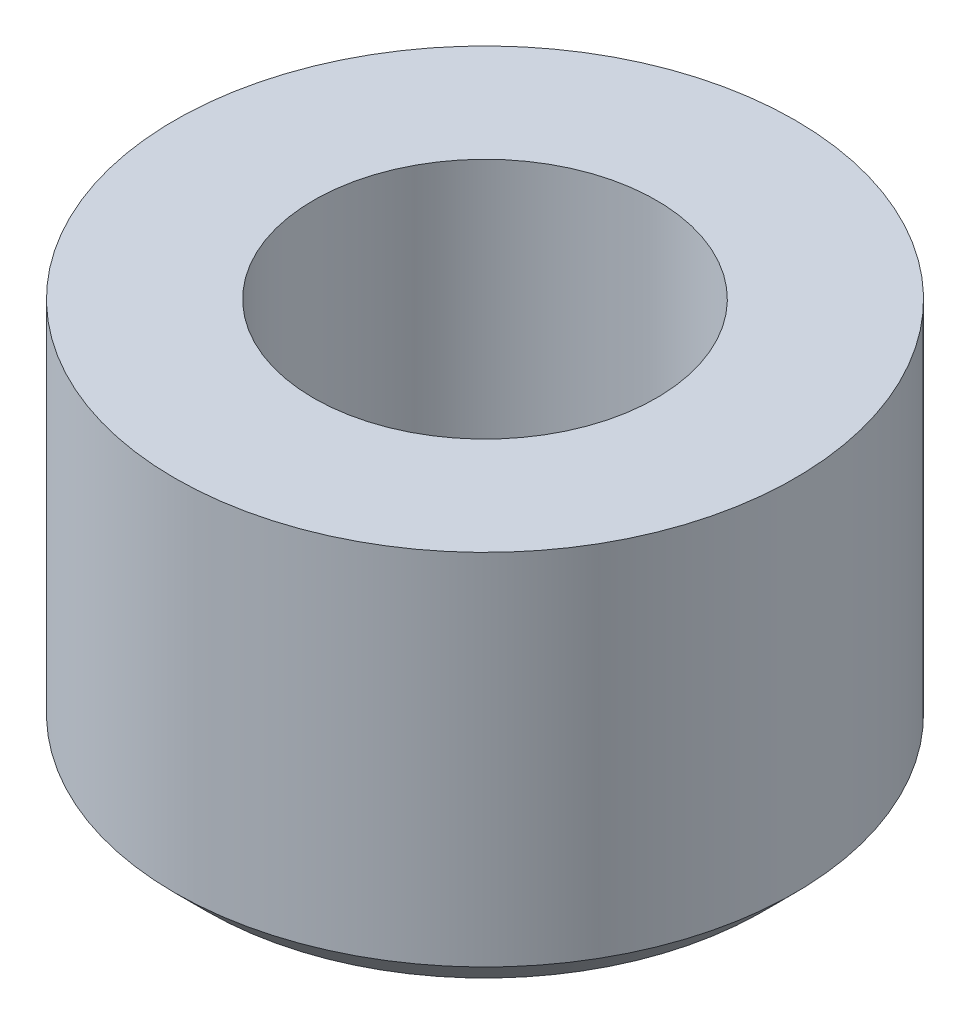
ISO-10303-21;
HEADER;
FILE_DESCRIPTION(('STEP AP214'),'2;1');
FILE_NAME('part.step','',(''),(''),'','','');
FILE_SCHEMA(('AUTOMOTIVE_DESIGN { 1 0 10303 214 1 1 1 1 }'));
ENDSEC;
DATA;
#1=APPLICATION_CONTEXT('core data for automotive mechanical design processes');
#2=APPLICATION_PROTOCOL_DEFINITION('international standard','automotive_design',2000,#1);
#3=PRODUCT_CONTEXT('',#1,'mechanical');
#4=PRODUCT('Part','Part','',(#3));
#5=PRODUCT_RELATED_PRODUCT_CATEGORY('part','',(#4));
#6=PRODUCT_DEFINITION_FORMATION('','',#4);
#7=PRODUCT_DEFINITION_CONTEXT('part definition',#1,'design');
#8=PRODUCT_DEFINITION('design','',#6,#7);
#9=PRODUCT_DEFINITION_SHAPE('','',#8);
#10=(LENGTH_UNIT() NAMED_UNIT(*) SI_UNIT(.MILLI.,.METRE.));
#11=(NAMED_UNIT(*) PLANE_ANGLE_UNIT() SI_UNIT($,.RADIAN.));
#12=(NAMED_UNIT(*) SI_UNIT($,.STERADIAN.) SOLID_ANGLE_UNIT());
#13=UNCERTAINTY_MEASURE_WITH_UNIT(LENGTH_MEASURE(1.E-05),#10,'distance_accuracy_value','');
#14=(GEOMETRIC_REPRESENTATION_CONTEXT(3) GLOBAL_UNCERTAINTY_ASSIGNED_CONTEXT((#13)) GLOBAL_UNIT_ASSIGNED_CONTEXT((#10,
#11,#12)) REPRESENTATION_CONTEXT('',''));
#15=CARTESIAN_POINT('',(0.,0.,0.));
#16=DIRECTION('',(0.,0.,1.));
#17=DIRECTION('',(1.,0.,0.));
#18=AXIS2_PLACEMENT_3D('',#15,#16,#17);
#19=CARTESIAN_POINT('',(0.,4.8,0.));
#20=DIRECTION('',(0.,1.,0.));
#21=DIRECTION('',(0.,0.,1.));
#22=AXIS2_PLACEMENT_3D('',#19,#20,#21);
#23=PLANE('',#22);
#24=CARTESIAN_POINT('',(0.,4.8,0.));
#25=DIRECTION('',(0.,1.,0.));
#26=DIRECTION('',(0.,0.,1.));
#27=AXIS2_PLACEMENT_3D('',#24,#25,#26);
#28=CIRCLE('',#27,3.8);
#29=CARTESIAN_POINT('',(0.,4.8,3.8));
#30=VERTEX_POINT('',#29);
#31=EDGE_CURVE('E49',#30,#30,#28,.T.);
#32=ORIENTED_EDGE('',*,*,#31,.T.);
#33=EDGE_LOOP('',(#32));
#34=FACE_BOUND('',#33,.T.);
#35=CARTESIAN_POINT('',(0.,4.8,0.));
#36=DIRECTION('',(0.,1.,0.));
#37=DIRECTION('',(0.,0.,1.));
#38=AXIS2_PLACEMENT_3D('',#35,#36,#37);
#39=CIRCLE('',#38,2.1);
#40=CARTESIAN_POINT('',(0.,4.8,2.1));
#41=VERTEX_POINT('',#40);
#42=EDGE_CURVE('E53',#41,#41,#39,.T.);
#43=ORIENTED_EDGE('',*,*,#42,.F.);
#44=EDGE_LOOP('',(#43));
#45=FACE_BOUND('',#44,.T.);
#46=ADVANCED_FACE('F37',(#34,#45),#23,.T.);
#47=CARTESIAN_POINT('',(0.,0.,0.));
#48=DIRECTION('',(0.,1.,0.));
#49=DIRECTION('',(0.,0.,1.));
#50=AXIS2_PLACEMENT_3D('',#47,#48,#49);
#51=PLANE('',#50);
#52=CARTESIAN_POINT('',(0.,0.,0.));
#53=DIRECTION('',(0.,1.,0.));
#54=DIRECTION('',(0.,0.,1.));
#55=AXIS2_PLACEMENT_3D('',#52,#53,#54);
#56=CIRCLE('',#55,3.4);
#57=CARTESIAN_POINT('',(0.,0.,3.4));
#58=VERTEX_POINT('',#57);
#59=EDGE_CURVE('E10',#58,#58,#56,.F.);
#60=ORIENTED_EDGE('',*,*,#59,.T.);
#61=EDGE_LOOP('',(#60));
#62=FACE_BOUND('',#61,.T.);
#63=CARTESIAN_POINT('',(0.,0.,0.));
#64=DIRECTION('',(0.,1.,0.));
#65=DIRECTION('',(0.,0.,1.));
#66=AXIS2_PLACEMENT_3D('',#63,#64,#65);
#67=CIRCLE('',#66,2.1);
#68=CARTESIAN_POINT('',(0.,0.,2.1));
#69=VERTEX_POINT('',#68);
#70=EDGE_CURVE('E56',#69,#69,#67,.T.);
#71=ORIENTED_EDGE('',*,*,#70,.T.);
#72=EDGE_LOOP('',(#71));
#73=FACE_BOUND('',#72,.T.);
#74=ADVANCED_FACE('F66',(#62,#73),#51,.F.);
#75=CARTESIAN_POINT('',(0.,4.8,0.));
#76=DIRECTION('',(0.,-1.,0.));
#77=DIRECTION('',(0.,0.,-1.));
#78=AXIS2_PLACEMENT_3D('',#75,#76,#77);
#79=CYLINDRICAL_SURFACE('',#78,3.8);
#80=CARTESIAN_POINT('',(0.,0.399999869282062,0.));
#81=DIRECTION('',(0.,1.,0.));
#82=DIRECTION('',(0.,0.,1.));
#83=AXIS2_PLACEMENT_3D('',#80,#81,#82);
#84=CIRCLE('',#83,3.8);
#85=CARTESIAN_POINT('',(0.,0.399999869282062,3.8));
#86=VERTEX_POINT('',#85);
#87=EDGE_CURVE('E45',#86,#86,#84,.T.);
#88=ORIENTED_EDGE('',*,*,#87,.T.);
#89=EDGE_LOOP('',(#88));
#90=FACE_BOUND('',#89,.T.);
#91=ORIENTED_EDGE('',*,*,#31,.F.);
#92=EDGE_LOOP('',(#91));
#93=FACE_BOUND('',#92,.T.);
#94=ADVANCED_FACE('F72',(#90,#93),#79,.T.);
#95=CARTESIAN_POINT('',(0.,4.8,0.));
#96=DIRECTION('',(0.,-1.,0.));
#97=DIRECTION('',(0.,0.,-1.));
#98=AXIS2_PLACEMENT_3D('',#95,#96,#97);
#99=CYLINDRICAL_SURFACE('',#98,2.1);
#100=ORIENTED_EDGE('',*,*,#42,.T.);
#101=EDGE_LOOP('',(#100));
#102=FACE_BOUND('',#101,.T.);
#103=ORIENTED_EDGE('',*,*,#70,.F.);
#104=EDGE_LOOP('',(#103));
#105=FACE_BOUND('',#104,.T.);
#106=ADVANCED_FACE('F62',(#102,#105),#99,.F.);
#107=CARTESIAN_POINT('',(0.,0.399999869282062,0.));
#108=DIRECTION('',(0.,1.,0.));
#109=DIRECTION('',(0.,0.,1.));
#110=AXIS2_PLACEMENT_3D('',#107,#108,#109);
#111=CONICAL_SURFACE('',#110,3.8,0.785398326794902);
#112=CARTESIAN_POINT('',(0.,0.,3.4));
#113=CARTESIAN_POINT('',(0.,0.00416666530502154,3.40416666666666));
#114=CARTESIAN_POINT('',(0.,0.008333330610043,3.40833333333333));
#115=CARTESIAN_POINT('',(0.,0.0166666612200859,3.41666666666666));
#116=CARTESIAN_POINT('',(0.,0.0208333265251073,3.42083333333333));
#117=CARTESIAN_POINT('',(0.,0.0291666571351503,3.42916666666666));
#118=CARTESIAN_POINT('',(0.,0.0333333224401718,3.43333333333333));
#119=CARTESIAN_POINT('',(0.,0.0416666530502148,3.44166666666666));
#120=CARTESIAN_POINT('',(0.,0.0458333183552363,3.44583333333333));
#121=CARTESIAN_POINT('',(0.,0.0541666489652792,3.45416666666666));
#122=CARTESIAN_POINT('',(0.,0.0583333142703006,3.45833333333333));
#123=CARTESIAN_POINT('',(0.,0.0666666448803436,3.46666666666666));
#124=CARTESIAN_POINT('',(0.,0.0708333101853651,3.47083333333333));
#125=CARTESIAN_POINT('',(0.,0.0791666407954081,3.47916666666666));
#126=CARTESIAN_POINT('',(0.,0.0833333061004295,3.48333333333333));
#127=CARTESIAN_POINT('',(0.,0.0916666367104725,3.49166666666666));
#128=CARTESIAN_POINT('',(0.,0.095833302015494,3.49583333333333));
#129=CARTESIAN_POINT('',(0.,0.104166632625537,3.50416666666666));
#130=CARTESIAN_POINT('',(0.,0.108333297930558,3.50833333333333));
#131=CARTESIAN_POINT('',(0.,0.116666628540601,3.51666666666666));
#132=CARTESIAN_POINT('',(0.,0.120833293845623,3.52083333333333));
#133=CARTESIAN_POINT('',(0.,0.129166624455666,3.52916666666666));
#134=CARTESIAN_POINT('',(0.,0.133333289760687,3.53333333333333));
#135=CARTESIAN_POINT('',(0.,0.14166662037073,3.54166666666666));
#136=CARTESIAN_POINT('',(0.,0.145833285675752,3.54583333333333));
#137=CARTESIAN_POINT('',(0.,0.154166616285795,3.55416666666666));
#138=CARTESIAN_POINT('',(0.,0.158333281590816,3.55833333333333));
#139=CARTESIAN_POINT('',(0.,0.166666612200859,3.56666666666666));
#140=CARTESIAN_POINT('',(0.,0.170833277505881,3.57083333333333));
#141=CARTESIAN_POINT('',(0.,0.179166608115923,3.57916666666666));
#142=CARTESIAN_POINT('',(0.,0.183333273420945,3.58333333333333));
#143=CARTESIAN_POINT('',(0.,0.191666604030988,3.59166666666666));
#144=CARTESIAN_POINT('',(0.,0.195833269336009,3.59583333333333));
#145=CARTESIAN_POINT('',(0.,0.204166599946052,3.60416666666666));
#146=CARTESIAN_POINT('',(0.,0.208333265251074,3.60833333333333));
#147=CARTESIAN_POINT('',(0.,0.216666595861117,3.61666666666666));
#148=CARTESIAN_POINT('',(0.,0.220833261166138,3.62083333333333));
#149=CARTESIAN_POINT('',(0.,0.229166591776181,3.62916666666667));
#150=CARTESIAN_POINT('',(0.,0.233333257081203,3.63333333333333));
#151=CARTESIAN_POINT('',(0.,0.241666587691246,3.64166666666666));
#152=CARTESIAN_POINT('',(0.,0.245833252996267,3.64583333333333));
#153=CARTESIAN_POINT('',(0.,0.25416658360631,3.65416666666667));
#154=CARTESIAN_POINT('',(0.,0.258333248911332,3.65833333333333));
#155=CARTESIAN_POINT('',(0.,0.266666579521375,3.66666666666667));
#156=CARTESIAN_POINT('',(0.,0.270833244826396,3.67083333333333));
#157=CARTESIAN_POINT('',(0.,0.279166575436439,3.67916666666667));
#158=CARTESIAN_POINT('',(0.,0.28333324074146,3.68333333333333));
#159=CARTESIAN_POINT('',(0.,0.291666571351503,3.69166666666667));
#160=CARTESIAN_POINT('',(0.,0.295833236656525,3.69583333333333));
#161=CARTESIAN_POINT('',(0.,0.304166567266568,3.70416666666667));
#162=CARTESIAN_POINT('',(0.,0.308333232571589,3.70833333333333));
#163=CARTESIAN_POINT('',(0.,0.316666563181632,3.71666666666667));
#164=CARTESIAN_POINT('',(0.,0.320833228486654,3.72083333333333));
#165=CARTESIAN_POINT('',(0.,0.329166559096697,3.72916666666667));
#166=CARTESIAN_POINT('',(0.,0.333333224401718,3.73333333333333));
#167=CARTESIAN_POINT('',(0.,0.341666555011761,3.74166666666667));
#168=CARTESIAN_POINT('',(0.,0.345833220316783,3.74583333333333));
#169=CARTESIAN_POINT('',(0.,0.354166550926826,3.75416666666667));
#170=CARTESIAN_POINT('',(0.,0.358333216231847,3.75833333333333));
#171=CARTESIAN_POINT('',(0.,0.36666654684189,3.76666666666667));
#172=CARTESIAN_POINT('',(0.,0.370833212146912,3.77083333333333));
#173=CARTESIAN_POINT('',(0.,0.379166542756954,3.77916666666667));
#174=CARTESIAN_POINT('',(0.,0.383333208061976,3.78333333333333));
#175=CARTESIAN_POINT('',(0.,0.391666538672019,3.79166666666667));
#176=CARTESIAN_POINT('',(0.,0.395833203977041,3.79583333333333));
#177=CARTESIAN_POINT('',(0.,0.399999869282062,3.8));
#178=B_SPLINE_CURVE_WITH_KNOTS('',3,(#112,#113,#114,#115,#116,#117,#118,#119,#120,#121,#122,
#123,#124,#125,#126,#127,#128,#129,#130,#131,#132,#133,#134,#135,#136,#137,#138,#139,#140,#141,
#142,#143,#144,#145,#146,#147,#148,#149,#150,#151,#152,#153,#154,#155,#156,#157,#158,#159,#160,
#161,#162,#163,#164,#165,#166,#167,#168,#169,#170,#171,#172,#173,#174,#175,#176,#177),
.UNSPECIFIED.,.F.,.F.,(4,2,2,2,2,2,2,2,2,2,2,2,2,2,2,2,2,2,2,2,2,2,2,2,2,2,2,2,2,2,2,2,4),(0.,
0.0176776666411783,0.0353553332823568,0.053032999923535,0.0707106665647133,0.0883883332058918,
0.10606599984707,0.123743666488249,0.141421333129427,0.159098999770605,0.176776666411784,
0.194454333052962,0.21213199969414,0.229809666335319,0.247487332976497,0.265164999617675,
0.282842666258854,0.300520332900032,0.318197999541211,0.335875666182389,0.353553332823568,
0.371230999464746,0.388908666105924,0.406586332747102,0.424263999388281,0.441941666029459,
0.459619332670637,0.477296999311816,0.494974665952994,0.512652332594173,0.530329999235351,
0.548007665876529,0.565685332517708),.UNSPECIFIED.);
#179=EDGE_CURVE('BSEAM40',#58,#86,#178,.T.);
#180=ORIENTED_EDGE('',*,*,#59,.F.);
#181=ORIENTED_EDGE('',*,*,#87,.F.);
#182=ORIENTED_EDGE('',*,*,#179,.T.);
#183=ORIENTED_EDGE('',*,*,#179,.F.);
#184=EDGE_LOOP('',(#180,#182,#181,#183));
#185=FACE_BOUND('',#184,.T.);
#186=ADVANCED_FACE('F40',(#185),#111,.T.);
#187=CLOSED_SHELL('',(#46,#74,#94,#106,#186));
#188=MANIFOLD_SOLID_BREP('B2',#187);
#189=ADVANCED_BREP_SHAPE_REPRESENTATION('',(#18,#188),#14);
#190=SHAPE_DEFINITION_REPRESENTATION(#9,#189);
ENDSEC;
END-ISO-10303-21;
